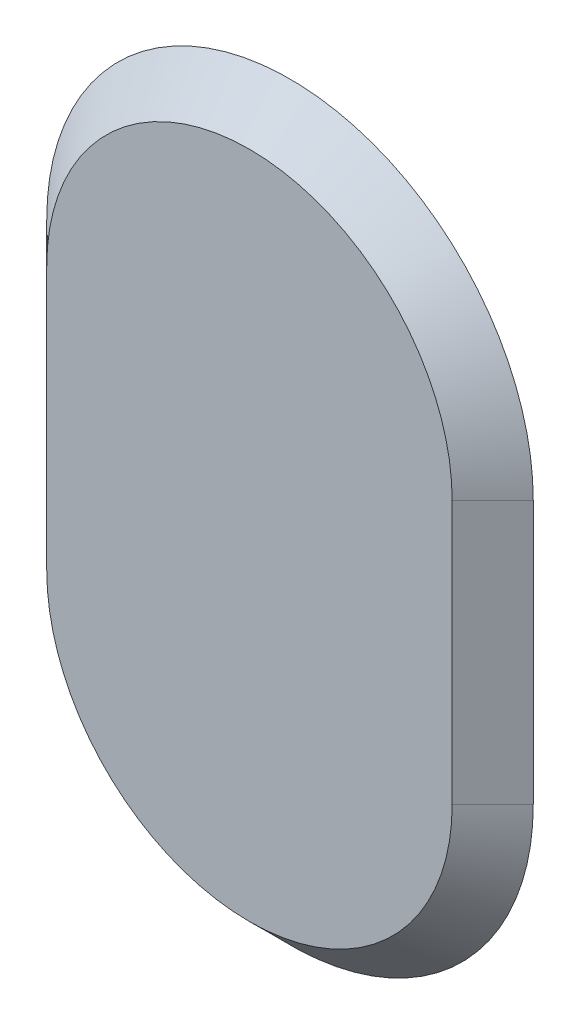
ISO-10303-21;
HEADER;
FILE_DESCRIPTION(('STEP AP214'),'2;1');
FILE_NAME('part.step','',(''),(''),'','','');
FILE_SCHEMA(('AUTOMOTIVE_DESIGN { 1 0 10303 214 1 1 1 1 }'));
ENDSEC;
DATA;
#1=APPLICATION_CONTEXT('core data for automotive mechanical design processes');
#2=APPLICATION_PROTOCOL_DEFINITION('international standard','automotive_design',2000,#1);
#3=PRODUCT_CONTEXT('',#1,'mechanical');
#4=PRODUCT('Part','Part','',(#3));
#5=PRODUCT_RELATED_PRODUCT_CATEGORY('part','',(#4));
#6=PRODUCT_DEFINITION_FORMATION('','',#4);
#7=PRODUCT_DEFINITION_CONTEXT('part definition',#1,'design');
#8=PRODUCT_DEFINITION('design','',#6,#7);
#9=PRODUCT_DEFINITION_SHAPE('','',#8);
#10=(LENGTH_UNIT() NAMED_UNIT(*) SI_UNIT(.MILLI.,.METRE.));
#11=(NAMED_UNIT(*) PLANE_ANGLE_UNIT() SI_UNIT($,.RADIAN.));
#12=(NAMED_UNIT(*) SI_UNIT($,.STERADIAN.) SOLID_ANGLE_UNIT());
#13=UNCERTAINTY_MEASURE_WITH_UNIT(LENGTH_MEASURE(1.E-05),#10,'distance_accuracy_value','');
#14=(GEOMETRIC_REPRESENTATION_CONTEXT(3) GLOBAL_UNCERTAINTY_ASSIGNED_CONTEXT((#13)) GLOBAL_UNIT_ASSIGNED_CONTEXT((#10,
#11,#12)) REPRESENTATION_CONTEXT('',''));
#15=CARTESIAN_POINT('',(0.,0.,0.));
#16=DIRECTION('',(0.,0.,1.));
#17=DIRECTION('',(1.,0.,0.));
#18=AXIS2_PLACEMENT_3D('',#15,#16,#17);
#19=CARTESIAN_POINT('',(0.,-3.25,1.));
#20=DIRECTION('',(0.,0.,1.));
#21=DIRECTION('',(1.,0.,0.));
#22=AXIS2_PLACEMENT_3D('',#19,#20,#21);
#23=PLANE('',#22);
#24=DIRECTION('',(0.,-1.,0.));
#25=VECTOR('',#24,1.);
#26=CARTESIAN_POINT('',(-5.,-3.25,1.));
#27=LINE('',#26,#25);
#28=CARTESIAN_POINT('',(-5.,3.25,1.));
#29=VERTEX_POINT('',#28);
#30=CARTESIAN_POINT('',(-5.,-3.25,1.));
#31=VERTEX_POINT('',#30);
#32=EDGE_CURVE('E67',#29,#31,#27,.T.);
#33=ORIENTED_EDGE('',*,*,#32,.T.);
#34=CARTESIAN_POINT('',(0.,-3.25,1.));
#35=DIRECTION('',(0.,0.,1.));
#36=DIRECTION('',(1.,0.,0.));
#37=AXIS2_PLACEMENT_3D('',#34,#35,#36);
#38=CIRCLE('',#37,5.);
#39=CARTESIAN_POINT('',(5.,-3.25,1.));
#40=VERTEX_POINT('',#39);
#41=EDGE_CURVE('E11',#31,#40,#38,.T.);
#42=ORIENTED_EDGE('',*,*,#41,.T.);
#43=DIRECTION('',(0.,1.,0.));
#44=VECTOR('',#43,1.);
#45=CARTESIAN_POINT('',(5.,3.25,1.));
#46=LINE('',#45,#44);
#47=CARTESIAN_POINT('',(5.,3.25,1.));
#48=VERTEX_POINT('',#47);
#49=EDGE_CURVE('E52',#40,#48,#46,.T.);
#50=ORIENTED_EDGE('',*,*,#49,.T.);
#51=CARTESIAN_POINT('',(0.,3.25,1.));
#52=DIRECTION('',(0.,0.,1.));
#53=DIRECTION('',(1.,0.,0.));
#54=AXIS2_PLACEMENT_3D('',#51,#52,#53);
#55=CIRCLE('',#54,5.);
#56=EDGE_CURVE('E119',#48,#29,#55,.T.);
#57=ORIENTED_EDGE('',*,*,#56,.T.);
#58=EDGE_LOOP('',(#33,#42,#50,#57));
#59=FACE_BOUND('',#58,.T.);
#60=ADVANCED_FACE('F41',(#59),#23,.T.);
#61=CARTESIAN_POINT('',(0.,-3.25,0.));
#62=DIRECTION('',(0.,0.,1.));
#63=DIRECTION('',(1.,0.,0.));
#64=AXIS2_PLACEMENT_3D('',#61,#62,#63);
#65=PLANE('',#64);
#66=CARTESIAN_POINT('',(0.,-3.25,0.));
#67=DIRECTION('',(0.,0.,1.));
#68=DIRECTION('',(1.,0.,0.));
#69=AXIS2_PLACEMENT_3D('',#66,#67,#68);
#70=CIRCLE('',#69,6.);
#71=CARTESIAN_POINT('',(-6.,-3.25,0.));
#72=VERTEX_POINT('',#71);
#73=CARTESIAN_POINT('',(6.,-3.25,0.));
#74=VERTEX_POINT('',#73);
#75=EDGE_CURVE('E90',#72,#74,#70,.T.);
#76=ORIENTED_EDGE('',*,*,#75,.F.);
#77=DIRECTION('',(0.,-1.,0.));
#78=VECTOR('',#77,1.);
#79=CARTESIAN_POINT('',(-6.,-3.25,0.));
#80=LINE('',#79,#78);
#81=CARTESIAN_POINT('',(-6.,3.25,0.));
#82=VERTEX_POINT('',#81);
#83=EDGE_CURVE('E116',#82,#72,#80,.T.);
#84=ORIENTED_EDGE('',*,*,#83,.F.);
#85=CARTESIAN_POINT('',(0.,3.25,0.));
#86=DIRECTION('',(0.,0.,1.));
#87=DIRECTION('',(1.,0.,0.));
#88=AXIS2_PLACEMENT_3D('',#85,#86,#87);
#89=CIRCLE('',#88,6.);
#90=CARTESIAN_POINT('',(6.,3.25,0.));
#91=VERTEX_POINT('',#90);
#92=EDGE_CURVE('E92',#91,#82,#89,.T.);
#93=ORIENTED_EDGE('',*,*,#92,.F.);
#94=DIRECTION('',(0.,1.,0.));
#95=VECTOR('',#94,1.);
#96=CARTESIAN_POINT('',(6.,-3.25,0.));
#97=LINE('',#96,#95);
#98=EDGE_CURVE('E88',#74,#91,#97,.T.);
#99=ORIENTED_EDGE('',*,*,#98,.F.);
#100=EDGE_LOOP('',(#76,#84,#93,#99));
#101=FACE_BOUND('',#100,.T.);
#102=ADVANCED_FACE('F89',(#101),#65,.F.);
#103=CARTESIAN_POINT('',(0.,3.25,1.));
#104=DIRECTION('',(0.,0.,-1.));
#105=DIRECTION('',(-1.,0.,0.));
#106=AXIS2_PLACEMENT_3D('',#103,#104,#105);
#107=CONICAL_SURFACE('',#106,5.,0.785398163397445);
#108=DIRECTION('',(-0.707106781186545,0.,0.70710678118655));
#109=VECTOR('',#108,1.);
#110=CARTESIAN_POINT('',(6.,3.25,0.));
#111=LINE('',#110,#109);
#112=EDGE_CURVE('E107',#91,#48,#111,.T.);
#113=ORIENTED_EDGE('',*,*,#112,.F.);
#114=ORIENTED_EDGE('',*,*,#92,.T.);
#115=DIRECTION('',(-0.707106781186545,0.,-0.70710678118655));
#116=VECTOR('',#115,1.);
#117=CARTESIAN_POINT('',(-5.,3.25,1.));
#118=LINE('',#117,#116);
#119=EDGE_CURVE('E46',#29,#82,#118,.T.);
#120=ORIENTED_EDGE('',*,*,#119,.F.);
#121=ORIENTED_EDGE('',*,*,#56,.F.);
#122=EDGE_LOOP('',(#113,#114,#120,#121));
#123=FACE_BOUND('',#122,.T.);
#124=ADVANCED_FACE('F44',(#123),#107,.T.);
#125=CARTESIAN_POINT('',(-5.,-3.25,1.));
#126=DIRECTION('',(-0.70710678118655,0.,0.707106781186545));
#127=DIRECTION('',(0.,1.,0.));
#128=AXIS2_PLACEMENT_3D('',#125,#126,#127);
#129=PLANE('',#128);
#130=ORIENTED_EDGE('',*,*,#119,.T.);
#131=ORIENTED_EDGE('',*,*,#83,.T.);
#132=DIRECTION('',(-0.707106781186545,0.,-0.70710678118655));
#133=VECTOR('',#132,1.);
#134=CARTESIAN_POINT('',(-5.,-3.25,1.));
#135=LINE('',#134,#133);
#136=EDGE_CURVE('E99',#31,#72,#135,.T.);
#137=ORIENTED_EDGE('',*,*,#136,.F.);
#138=ORIENTED_EDGE('',*,*,#32,.F.);
#139=EDGE_LOOP('',(#130,#131,#137,#138));
#140=FACE_BOUND('',#139,.T.);
#141=ADVANCED_FACE('F115',(#140),#129,.T.);
#142=CARTESIAN_POINT('',(5.,-3.25,1.));
#143=DIRECTION('',(0.70710678118655,0.,0.707106781186545));
#144=DIRECTION('',(0.,-1.,0.));
#145=AXIS2_PLACEMENT_3D('',#142,#143,#144);
#146=PLANE('',#145);
#147=ORIENTED_EDGE('',*,*,#112,.T.);
#148=ORIENTED_EDGE('',*,*,#49,.F.);
#149=DIRECTION('',(-0.707106781186545,0.,0.70710678118655));
#150=VECTOR('',#149,1.);
#151=CARTESIAN_POINT('',(6.,-3.25,0.));
#152=LINE('',#151,#150);
#153=EDGE_CURVE('E60',#74,#40,#152,.T.);
#154=ORIENTED_EDGE('',*,*,#153,.F.);
#155=ORIENTED_EDGE('',*,*,#98,.T.);
#156=EDGE_LOOP('',(#147,#148,#154,#155));
#157=FACE_BOUND('',#156,.T.);
#158=ADVANCED_FACE('F103',(#157),#146,.T.);
#159=CARTESIAN_POINT('',(0.,-3.25,1.));
#160=DIRECTION('',(0.,0.,-1.));
#161=DIRECTION('',(-1.,0.,0.));
#162=AXIS2_PLACEMENT_3D('',#159,#160,#161);
#163=CONICAL_SURFACE('',#162,5.,0.785398163397445);
#164=ORIENTED_EDGE('',*,*,#136,.T.);
#165=ORIENTED_EDGE('',*,*,#75,.T.);
#166=ORIENTED_EDGE('',*,*,#153,.T.);
#167=ORIENTED_EDGE('',*,*,#41,.F.);
#168=EDGE_LOOP('',(#164,#165,#166,#167));
#169=FACE_BOUND('',#168,.T.);
#170=ADVANCED_FACE('F98',(#169),#163,.T.);
#171=CLOSED_SHELL('',(#60,#102,#124,#141,#158,#170));
#172=MANIFOLD_SOLID_BREP('B2',#171);
#173=ADVANCED_BREP_SHAPE_REPRESENTATION('',(#18,#172),#14);
#174=SHAPE_DEFINITION_REPRESENTATION(#9,#173);
ENDSEC;
END-ISO-10303-21;
